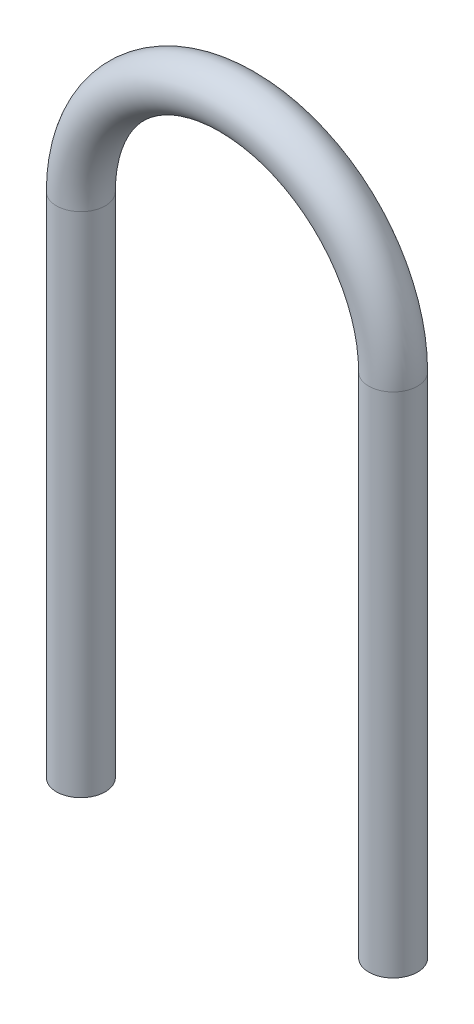
ISO-10303-21;
HEADER;
FILE_DESCRIPTION(('STEP AP214'),'2;1');
FILE_NAME('part.step','',(''),(''),'','','');
FILE_SCHEMA(('AUTOMOTIVE_DESIGN { 1 0 10303 214 1 1 1 1 }'));
ENDSEC;
DATA;
#1=APPLICATION_CONTEXT('core data for automotive mechanical design processes');
#2=APPLICATION_PROTOCOL_DEFINITION('international standard','automotive_design',2000,#1);
#3=PRODUCT_CONTEXT('',#1,'mechanical');
#4=PRODUCT('Part','Part','',(#3));
#5=PRODUCT_RELATED_PRODUCT_CATEGORY('part','',(#4));
#6=PRODUCT_DEFINITION_FORMATION('','',#4);
#7=PRODUCT_DEFINITION_CONTEXT('part definition',#1,'design');
#8=PRODUCT_DEFINITION('design','',#6,#7);
#9=PRODUCT_DEFINITION_SHAPE('','',#8);
#10=(LENGTH_UNIT() NAMED_UNIT(*) SI_UNIT(.MILLI.,.METRE.));
#11=(NAMED_UNIT(*) PLANE_ANGLE_UNIT() SI_UNIT($,.RADIAN.));
#12=(NAMED_UNIT(*) SI_UNIT($,.STERADIAN.) SOLID_ANGLE_UNIT());
#13=UNCERTAINTY_MEASURE_WITH_UNIT(LENGTH_MEASURE(1.E-05),#10,'distance_accuracy_value','');
#14=(GEOMETRIC_REPRESENTATION_CONTEXT(3) GLOBAL_UNCERTAINTY_ASSIGNED_CONTEXT((#13)) GLOBAL_UNIT_ASSIGNED_CONTEXT((#10,
#11,#12)) REPRESENTATION_CONTEXT('',''));
#15=CARTESIAN_POINT('',(0.,0.,0.));
#16=DIRECTION('',(0.,0.,1.));
#17=DIRECTION('',(1.,0.,0.));
#18=AXIS2_PLACEMENT_3D('',#15,#16,#17);
#19=CARTESIAN_POINT('',(-25.4,-3.57845106896297E-13,0.));
#20=DIRECTION('',(0.,-1.,0.));
#21=DIRECTION('',(1.,0.,0.));
#22=AXIS2_PLACEMENT_3D('',#19,#20,#21);
#23=CYLINDRICAL_SURFACE('',#22,3.96875);
#24=CARTESIAN_POINT('',(-25.4,-3.57845106896297E-13,0.));
#25=DIRECTION('',(0.,-1.,0.));
#26=DIRECTION('',(0.,0.,1.));
#27=AXIS2_PLACEMENT_3D('',#24,#25,#26);
#28=CIRCLE('',#27,3.96875);
#29=CARTESIAN_POINT('',(-29.36875,-4.13758404848843E-13,0.));
#30=VERTEX_POINT('',#29);
#31=EDGE_CURVE('E36',#30,#30,#28,.T.);
#32=ORIENTED_EDGE('',*,*,#31,.T.);
#33=EDGE_LOOP('',(#32));
#34=FACE_BOUND('',#33,.T.);
#35=CARTESIAN_POINT('',(-25.4,-82.5500000000004,0.));
#36=DIRECTION('',(0.,-1.,0.));
#37=DIRECTION('',(0.,0.,1.));
#38=AXIS2_PLACEMENT_3D('',#35,#36,#37);
#39=CIRCLE('',#38,3.96875);
#40=CARTESIAN_POINT('',(-25.4,-82.5500000000004,3.96875));
#41=VERTEX_POINT('',#40);
#42=EDGE_CURVE('E10',#41,#41,#39,.T.);
#43=ORIENTED_EDGE('',*,*,#42,.F.);
#44=EDGE_LOOP('',(#43));
#45=FACE_BOUND('',#44,.T.);
#46=ADVANCED_FACE('F30',(#34,#45),#23,.T.);
#47=CARTESIAN_POINT('',(0.,0.,0.));
#48=DIRECTION('',(0.,0.,1.));
#49=DIRECTION('',(1.,0.,0.));
#50=AXIS2_PLACEMENT_3D('',#47,#48,#49);
#51=TOROIDAL_SURFACE('',#50,25.4,3.96875);
#52=CARTESIAN_POINT('',(25.4,0.,0.));
#53=DIRECTION('',(0.,1.,0.));
#54=DIRECTION('',(0.,0.,1.));
#55=AXIS2_PLACEMENT_3D('',#52,#53,#54);
#56=CIRCLE('',#55,3.96875);
#57=CARTESIAN_POINT('',(29.36875,0.,0.));
#58=VERTEX_POINT('',#57);
#59=EDGE_CURVE('E40',#58,#58,#56,.T.);
#60=CARTESIAN_POINT('',(0.,0.,0.));
#61=DIRECTION('',(0.,0.,1.));
#62=DIRECTION('',(1.,0.,0.));
#63=AXIS2_PLACEMENT_3D('',#60,#61,#62);
#64=CIRCLE('',#63,29.36875);
#65=EDGE_CURVE('',#58,#30,#64,.T.);
#66=ORIENTED_EDGE('',*,*,#59,.T.);
#67=ORIENTED_EDGE('',*,*,#31,.F.);
#68=ORIENTED_EDGE('',*,*,#65,.T.);
#69=ORIENTED_EDGE('',*,*,#65,.F.);
#70=EDGE_LOOP('',(#66,#68,#67,#69));
#71=FACE_BOUND('',#70,.T.);
#72=ADVANCED_FACE('F62',(#71),#51,.T.);
#73=CARTESIAN_POINT('',(25.4,0.,0.));
#74=DIRECTION('',(0.,-1.,0.));
#75=DIRECTION('',(1.,0.,0.));
#76=AXIS2_PLACEMENT_3D('',#73,#74,#75);
#77=CYLINDRICAL_SURFACE('',#76,3.96875);
#78=ORIENTED_EDGE('',*,*,#59,.F.);
#79=EDGE_LOOP('',(#78));
#80=FACE_BOUND('',#79,.T.);
#81=CARTESIAN_POINT('',(25.4,-82.55,0.));
#82=DIRECTION('',(0.,1.,0.));
#83=DIRECTION('',(0.,0.,1.));
#84=AXIS2_PLACEMENT_3D('',#81,#82,#83);
#85=CIRCLE('',#84,3.96875);
#86=CARTESIAN_POINT('',(25.4,-82.55,3.96875));
#87=VERTEX_POINT('',#86);
#88=EDGE_CURVE('E44',#87,#87,#85,.T.);
#89=ORIENTED_EDGE('',*,*,#88,.T.);
#90=EDGE_LOOP('',(#89));
#91=FACE_BOUND('',#90,.T.);
#92=ADVANCED_FACE('F50',(#80,#91),#77,.T.);
#93=CARTESIAN_POINT('',(-25.4,-82.5500000000004,0.));
#94=DIRECTION('',(0.,-1.,0.));
#95=DIRECTION('',(0.,0.,1.));
#96=AXIS2_PLACEMENT_3D('',#93,#94,#95);
#97=PLANE('',#96);
#98=ORIENTED_EDGE('',*,*,#42,.T.);
#99=EDGE_LOOP('',(#98));
#100=FACE_BOUND('',#99,.T.);
#101=ADVANCED_FACE('F54',(#100),#97,.T.);
#102=CARTESIAN_POINT('',(25.4,-82.55,0.));
#103=DIRECTION('',(0.,1.,0.));
#104=DIRECTION('',(0.,0.,1.));
#105=AXIS2_PLACEMENT_3D('',#102,#103,#104);
#106=PLANE('',#105);
#107=ORIENTED_EDGE('',*,*,#88,.F.);
#108=EDGE_LOOP('',(#107));
#109=FACE_BOUND('',#108,.T.);
#110=ADVANCED_FACE('F52',(#109),#106,.F.);
#111=CLOSED_SHELL('',(#46,#72,#92,#101,#110));
#112=MANIFOLD_SOLID_BREP('B2',#111);
#113=ADVANCED_BREP_SHAPE_REPRESENTATION('',(#18,#112),#14);
#114=SHAPE_DEFINITION_REPRESENTATION(#9,#113);
ENDSEC;
END-ISO-10303-21;
